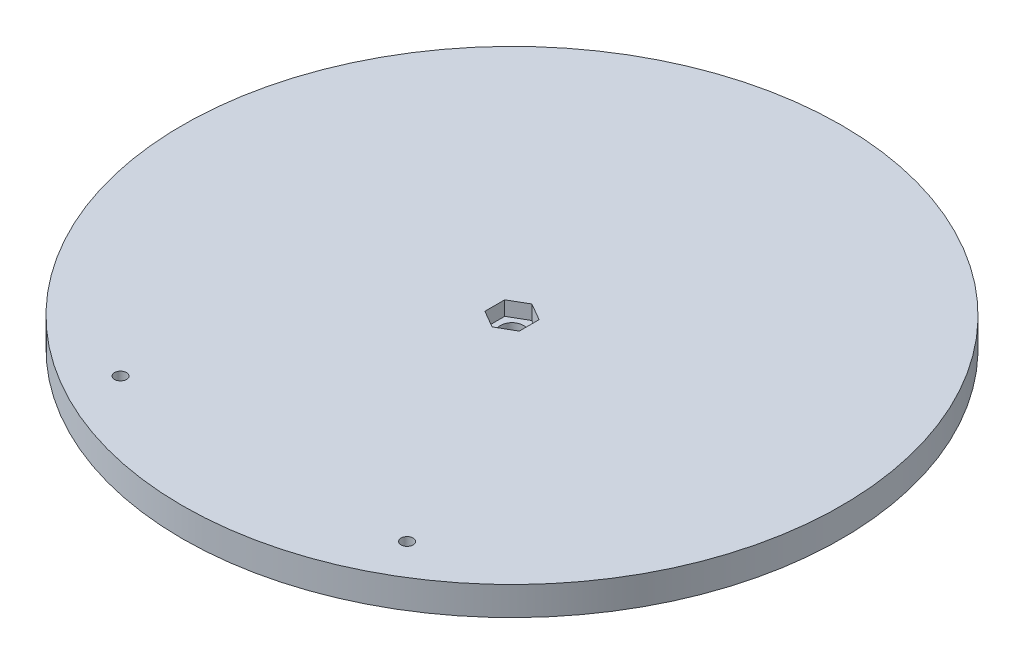
ISO-10303-21;
HEADER;
FILE_DESCRIPTION(('STEP AP214'),'2;1');
FILE_NAME('part.step','',(''),(''),'','','');
FILE_SCHEMA(('AUTOMOTIVE_DESIGN { 1 0 10303 214 1 1 1 1 }'));
ENDSEC;
DATA;
#1=APPLICATION_CONTEXT('core data for automotive mechanical design processes');
#2=APPLICATION_PROTOCOL_DEFINITION('international standard','automotive_design',2000,#1);
#3=PRODUCT_CONTEXT('',#1,'mechanical');
#4=PRODUCT('Part','Part','',(#3));
#5=PRODUCT_RELATED_PRODUCT_CATEGORY('part','',(#4));
#6=PRODUCT_DEFINITION_FORMATION('','',#4);
#7=PRODUCT_DEFINITION_CONTEXT('part definition',#1,'design');
#8=PRODUCT_DEFINITION('design','',#6,#7);
#9=PRODUCT_DEFINITION_SHAPE('','',#8);
#10=(LENGTH_UNIT() NAMED_UNIT(*) SI_UNIT(.MILLI.,.METRE.));
#11=(NAMED_UNIT(*) PLANE_ANGLE_UNIT() SI_UNIT($,.RADIAN.));
#12=(NAMED_UNIT(*) SI_UNIT($,.STERADIAN.) SOLID_ANGLE_UNIT());
#13=UNCERTAINTY_MEASURE_WITH_UNIT(LENGTH_MEASURE(1.E-05),#10,'distance_accuracy_value','');
#14=(GEOMETRIC_REPRESENTATION_CONTEXT(3) GLOBAL_UNCERTAINTY_ASSIGNED_CONTEXT((#13)) GLOBAL_UNIT_ASSIGNED_CONTEXT((#10,
#11,#12)) REPRESENTATION_CONTEXT('',''));
#15=CARTESIAN_POINT('',(0.,0.,0.));
#16=DIRECTION('',(0.,0.,1.));
#17=DIRECTION('',(1.,0.,0.));
#18=AXIS2_PLACEMENT_3D('',#15,#16,#17);
#19=CARTESIAN_POINT('',(0.,10.,0.));
#20=DIRECTION('',(0.,1.,0.));
#21=DIRECTION('',(0.,0.,1.));
#22=AXIS2_PLACEMENT_3D('',#19,#20,#21);
#23=PLANE('',#22);
#24=CARTESIAN_POINT('',(0.,10.,0.));
#25=DIRECTION('',(0.,1.,0.));
#26=DIRECTION('',(0.,0.,1.));
#27=AXIS2_PLACEMENT_3D('',#24,#25,#26);
#28=CIRCLE('',#27,115.);
#29=CARTESIAN_POINT('',(0.,10.,115.));
#30=VERTEX_POINT('',#29);
#31=EDGE_CURVE('E173',#30,#30,#28,.T.);
#32=ORIENTED_EDGE('',*,*,#31,.T.);
#33=EDGE_LOOP('',(#32));
#34=FACE_BOUND('',#33,.T.);
#35=DIRECTION('',(0.866025403784438,0.,-0.5));
#36=VECTOR('',#35,1.);
#37=CARTESIAN_POINT('',(3.,10.,5.19615242270663));
#38=LINE('',#37,#36);
#39=CARTESIAN_POINT('',(0.,10.,6.92820323027551));
#40=VERTEX_POINT('',#39);
#41=CARTESIAN_POINT('',(6.00000000000001,10.,3.46410161513775));
#42=VERTEX_POINT('',#41);
#43=EDGE_CURVE('E158',#40,#42,#38,.T.);
#44=ORIENTED_EDGE('',*,*,#43,.F.);
#45=DIRECTION('',(0.866025403784439,0.,0.5));
#46=VECTOR('',#45,1.);
#47=CARTESIAN_POINT('',(-3.,10.,5.19615242270663));
#48=LINE('',#47,#46);
#49=CARTESIAN_POINT('',(-6.,10.,3.46410161513776));
#50=VERTEX_POINT('',#49);
#51=EDGE_CURVE('E161',#50,#40,#48,.T.);
#52=ORIENTED_EDGE('',*,*,#51,.F.);
#53=DIRECTION('',(0.,0.,1.));
#54=VECTOR('',#53,1.);
#55=CARTESIAN_POINT('',(-6.,10.,0.));
#56=LINE('',#55,#54);
#57=CARTESIAN_POINT('',(-6.,10.,-3.46410161513775));
#58=VERTEX_POINT('',#57);
#59=EDGE_CURVE('E164',#58,#50,#56,.T.);
#60=ORIENTED_EDGE('',*,*,#59,.F.);
#61=DIRECTION('',(-0.866025403784439,0.,0.5));
#62=VECTOR('',#61,1.);
#63=CARTESIAN_POINT('',(-3.,10.,-5.19615242270663));
#64=LINE('',#63,#62);
#65=CARTESIAN_POINT('',(0.,10.,-6.92820323027551));
#66=VERTEX_POINT('',#65);
#67=EDGE_CURVE('E167',#66,#58,#64,.T.);
#68=ORIENTED_EDGE('',*,*,#67,.F.);
#69=DIRECTION('',(-0.866025403784439,0.,-0.5));
#70=VECTOR('',#69,1.);
#71=CARTESIAN_POINT('',(3.,10.,-5.19615242270663));
#72=LINE('',#71,#70);
#73=CARTESIAN_POINT('',(6.,10.,-3.46410161513775));
#74=VERTEX_POINT('',#73);
#75=EDGE_CURVE('E170',#74,#66,#72,.T.);
#76=ORIENTED_EDGE('',*,*,#75,.F.);
#77=DIRECTION('',(0.,0.,-1.));
#78=VECTOR('',#77,1.);
#79=CARTESIAN_POINT('',(6.,10.,0.));
#80=LINE('',#79,#78);
#81=EDGE_CURVE('E133',#42,#74,#80,.T.);
#82=ORIENTED_EDGE('',*,*,#81,.F.);
#83=EDGE_LOOP('',(#44,#52,#60,#68,#76,#82));
#84=FACE_BOUND('',#83,.T.);
#85=CARTESIAN_POINT('',(-50.,10.,86.6025403784439));
#86=DIRECTION('',(0.,1.,0.));
#87=DIRECTION('',(0.,0.,1.));
#88=AXIS2_PLACEMENT_3D('',#85,#86,#87);
#89=CIRCLE('',#88,2.1);
#90=CARTESIAN_POINT('',(-50.,10.,88.7025403784439));
#91=VERTEX_POINT('',#90);
#92=EDGE_CURVE('E324',#91,#91,#89,.T.);
#93=ORIENTED_EDGE('',*,*,#92,.F.);
#94=EDGE_LOOP('',(#93));
#95=FACE_BOUND('',#94,.T.);
#96=CARTESIAN_POINT('',(50.,10.,86.6025403784439));
#97=DIRECTION('',(0.,-1.,0.));
#98=DIRECTION('',(0.,0.,-1.));
#99=AXIS2_PLACEMENT_3D('',#96,#97,#98);
#100=CIRCLE('',#99,2.1);
#101=CARTESIAN_POINT('',(50.,10.,84.5025403784439));
#102=VERTEX_POINT('',#101);
#103=EDGE_CURVE('E319',#102,#102,#100,.T.);
#104=ORIENTED_EDGE('',*,*,#103,.T.);
#105=EDGE_LOOP('',(#104));
#106=FACE_BOUND('',#105,.T.);
#107=ADVANCED_FACE('F75',(#34,#84,#95,#106),#23,.T.);
#108=CARTESIAN_POINT('',(0.,0.,0.));
#109=DIRECTION('',(0.,1.,0.));
#110=DIRECTION('',(0.,0.,1.));
#111=AXIS2_PLACEMENT_3D('',#108,#109,#110);
#112=PLANE('',#111);
#113=CARTESIAN_POINT('',(-50.,0.,86.6025403784439));
#114=DIRECTION('',(0.,1.,0.));
#115=DIRECTION('',(0.,0.,1.));
#116=AXIS2_PLACEMENT_3D('',#113,#114,#115);
#117=CIRCLE('',#116,2.1);
#118=CARTESIAN_POINT('',(-50.,0.,88.7025403784439));
#119=VERTEX_POINT('',#118);
#120=EDGE_CURVE('E329',#119,#119,#117,.F.);
#121=ORIENTED_EDGE('',*,*,#120,.F.);
#122=EDGE_LOOP('',(#121));
#123=FACE_BOUND('',#122,.T.);
#124=CARTESIAN_POINT('',(0.,0.,0.));
#125=DIRECTION('',(0.,1.,0.));
#126=DIRECTION('',(0.,0.,1.));
#127=AXIS2_PLACEMENT_3D('',#124,#125,#126);
#128=CIRCLE('',#127,4.);
#129=CARTESIAN_POINT('',(0.,0.,4.));
#130=VERTEX_POINT('',#129);
#131=EDGE_CURVE('E326',#130,#130,#128,.T.);
#132=ORIENTED_EDGE('',*,*,#131,.T.);
#133=EDGE_LOOP('',(#132));
#134=FACE_BOUND('',#133,.T.);
#135=CARTESIAN_POINT('',(0.,0.,0.));
#136=DIRECTION('',(0.,1.,0.));
#137=DIRECTION('',(0.,0.,1.));
#138=AXIS2_PLACEMENT_3D('',#135,#136,#137);
#139=CIRCLE('',#138,115.);
#140=CARTESIAN_POINT('',(0.,0.,115.));
#141=VERTEX_POINT('',#140);
#142=EDGE_CURVE('E157',#141,#141,#139,.T.);
#143=ORIENTED_EDGE('',*,*,#142,.F.);
#144=EDGE_LOOP('',(#143));
#145=FACE_BOUND('',#144,.T.);
#146=CARTESIAN_POINT('',(50.,0.,86.6025403784439));
#147=DIRECTION('',(0.,1.,0.));
#148=DIRECTION('',(0.,0.,1.));
#149=AXIS2_PLACEMENT_3D('',#146,#147,#148);
#150=CIRCLE('',#149,2.1);
#151=CARTESIAN_POINT('',(50.,0.,88.7025403784439));
#152=VERTEX_POINT('',#151);
#153=EDGE_CURVE('E322',#152,#152,#150,.T.);
#154=ORIENTED_EDGE('',*,*,#153,.T.);
#155=EDGE_LOOP('',(#154));
#156=FACE_BOUND('',#155,.T.);
#157=ADVANCED_FACE('F194',(#123,#134,#145,#156),#112,.F.);
#158=CARTESIAN_POINT('',(3.,10.,5.19615242270663));
#159=DIRECTION('',(-0.5,0.,-0.866025403784438));
#160=DIRECTION('',(-0.866025403784438,0.,0.5));
#161=AXIS2_PLACEMENT_3D('',#158,#159,#160);
#162=PLANE('',#161);
#163=DIRECTION('',(0.866025403784438,0.,-0.5));
#164=VECTOR('',#163,1.);
#165=CARTESIAN_POINT('',(3.,5.,5.19615242270663));
#166=LINE('',#165,#164);
#167=CARTESIAN_POINT('',(0.,5.,6.92820323027551));
#168=VERTEX_POINT('',#167);
#169=CARTESIAN_POINT('',(6.00000000000001,5.,3.46410161513775));
#170=VERTEX_POINT('',#169);
#171=EDGE_CURVE('E90',#168,#170,#166,.T.);
#172=ORIENTED_EDGE('',*,*,#171,.F.);
#173=DIRECTION('',(0.,-1.,0.));
#174=VECTOR('',#173,1.);
#175=CARTESIAN_POINT('',(0.,10.,6.92820323027551));
#176=LINE('',#175,#174);
#177=EDGE_CURVE('E12',#40,#168,#176,.T.);
#178=ORIENTED_EDGE('',*,*,#177,.F.);
#179=ORIENTED_EDGE('',*,*,#43,.T.);
#180=DIRECTION('',(0.,-1.,0.));
#181=VECTOR('',#180,1.);
#182=CARTESIAN_POINT('',(6.00000000000001,10.,3.46410161513775));
#183=LINE('',#182,#181);
#184=EDGE_CURVE('E138',#42,#170,#183,.T.);
#185=ORIENTED_EDGE('',*,*,#184,.T.);
#186=EDGE_LOOP('',(#172,#178,#179,#185));
#187=FACE_BOUND('',#186,.T.);
#188=ADVANCED_FACE('F77',(#187),#162,.T.);
#189=CARTESIAN_POINT('',(-3.,10.,5.19615242270663));
#190=DIRECTION('',(0.5,0.,-0.866025403784439));
#191=DIRECTION('',(-0.866025403784439,0.,-0.5));
#192=AXIS2_PLACEMENT_3D('',#189,#190,#191);
#193=PLANE('',#192);
#194=DIRECTION('',(0.866025403784439,0.,0.5));
#195=VECTOR('',#194,1.);
#196=CARTESIAN_POINT('',(-3.,5.,5.19615242270663));
#197=LINE('',#196,#195);
#198=CARTESIAN_POINT('',(-6.,5.,3.46410161513776));
#199=VERTEX_POINT('',#198);
#200=EDGE_CURVE('E96',#199,#168,#197,.T.);
#201=ORIENTED_EDGE('',*,*,#200,.F.);
#202=DIRECTION('',(0.,-1.,0.));
#203=VECTOR('',#202,1.);
#204=CARTESIAN_POINT('',(-6.,10.,3.46410161513776));
#205=LINE('',#204,#203);
#206=EDGE_CURVE('E83',#50,#199,#205,.T.);
#207=ORIENTED_EDGE('',*,*,#206,.F.);
#208=ORIENTED_EDGE('',*,*,#51,.T.);
#209=ORIENTED_EDGE('',*,*,#177,.T.);
#210=EDGE_LOOP('',(#201,#207,#208,#209));
#211=FACE_BOUND('',#210,.T.);
#212=ADVANCED_FACE('F192',(#211),#193,.T.);
#213=CARTESIAN_POINT('',(-6.,10.,0.));
#214=DIRECTION('',(1.,0.,0.));
#215=DIRECTION('',(0.,0.,-1.));
#216=AXIS2_PLACEMENT_3D('',#213,#214,#215);
#217=PLANE('',#216);
#218=DIRECTION('',(0.,0.,1.));
#219=VECTOR('',#218,1.);
#220=CARTESIAN_POINT('',(-6.,5.,0.));
#221=LINE('',#220,#219);
#222=CARTESIAN_POINT('',(-6.,5.,-3.46410161513775));
#223=VERTEX_POINT('',#222);
#224=EDGE_CURVE('E154',#223,#199,#221,.T.);
#225=ORIENTED_EDGE('',*,*,#224,.F.);
#226=DIRECTION('',(0.,-1.,0.));
#227=VECTOR('',#226,1.);
#228=CARTESIAN_POINT('',(-6.,10.,-3.46410161513775));
#229=LINE('',#228,#227);
#230=EDGE_CURVE('E180',#58,#223,#229,.T.);
#231=ORIENTED_EDGE('',*,*,#230,.F.);
#232=ORIENTED_EDGE('',*,*,#59,.T.);
#233=ORIENTED_EDGE('',*,*,#206,.T.);
#234=EDGE_LOOP('',(#225,#231,#232,#233));
#235=FACE_BOUND('',#234,.T.);
#236=ADVANCED_FACE('F183',(#235),#217,.T.);
#237=CARTESIAN_POINT('',(-3.,10.,-5.19615242270663));
#238=DIRECTION('',(0.5,0.,0.866025403784439));
#239=DIRECTION('',(0.866025403784439,0.,-0.5));
#240=AXIS2_PLACEMENT_3D('',#237,#238,#239);
#241=PLANE('',#240);
#242=DIRECTION('',(-0.866025403784439,0.,0.5));
#243=VECTOR('',#242,1.);
#244=CARTESIAN_POINT('',(-3.,5.,-5.19615242270663));
#245=LINE('',#244,#243);
#246=CARTESIAN_POINT('',(0.,5.,-6.92820323027551));
#247=VERTEX_POINT('',#246);
#248=EDGE_CURVE('E146',#247,#223,#245,.T.);
#249=ORIENTED_EDGE('',*,*,#248,.F.);
#250=DIRECTION('',(0.,-1.,0.));
#251=VECTOR('',#250,1.);
#252=CARTESIAN_POINT('',(0.,10.,-6.92820323027551));
#253=LINE('',#252,#251);
#254=EDGE_CURVE('E137',#66,#247,#253,.T.);
#255=ORIENTED_EDGE('',*,*,#254,.F.);
#256=ORIENTED_EDGE('',*,*,#67,.T.);
#257=ORIENTED_EDGE('',*,*,#230,.T.);
#258=EDGE_LOOP('',(#249,#255,#256,#257));
#259=FACE_BOUND('',#258,.T.);
#260=ADVANCED_FACE('F187',(#259),#241,.T.);
#261=CARTESIAN_POINT('',(3.,10.,-5.19615242270663));
#262=DIRECTION('',(-0.5,0.,0.866025403784439));
#263=DIRECTION('',(0.866025403784439,0.,0.5));
#264=AXIS2_PLACEMENT_3D('',#261,#262,#263);
#265=PLANE('',#264);
#266=DIRECTION('',(-0.866025403784439,0.,-0.5));
#267=VECTOR('',#266,1.);
#268=CARTESIAN_POINT('',(3.,5.,-5.19615242270663));
#269=LINE('',#268,#267);
#270=CARTESIAN_POINT('',(6.,5.,-3.46410161513775));
#271=VERTEX_POINT('',#270);
#272=EDGE_CURVE('E142',#271,#247,#269,.T.);
#273=ORIENTED_EDGE('',*,*,#272,.F.);
#274=DIRECTION('',(0.,-1.,0.));
#275=VECTOR('',#274,1.);
#276=CARTESIAN_POINT('',(6.,10.,-3.46410161513775));
#277=LINE('',#276,#275);
#278=EDGE_CURVE('E127',#74,#271,#277,.T.);
#279=ORIENTED_EDGE('',*,*,#278,.F.);
#280=ORIENTED_EDGE('',*,*,#75,.T.);
#281=ORIENTED_EDGE('',*,*,#254,.T.);
#282=EDGE_LOOP('',(#273,#279,#280,#281));
#283=FACE_BOUND('',#282,.T.);
#284=ADVANCED_FACE('F143',(#283),#265,.T.);
#285=CARTESIAN_POINT('',(6.,10.,0.));
#286=DIRECTION('',(-1.,0.,0.));
#287=DIRECTION('',(0.,0.,1.));
#288=AXIS2_PLACEMENT_3D('',#285,#286,#287);
#289=PLANE('',#288);
#290=DIRECTION('',(0.,0.,-1.));
#291=VECTOR('',#290,1.);
#292=CARTESIAN_POINT('',(6.,5.,0.));
#293=LINE('',#292,#291);
#294=EDGE_CURVE('E131',#170,#271,#293,.T.);
#295=ORIENTED_EDGE('',*,*,#294,.F.);
#296=ORIENTED_EDGE('',*,*,#184,.F.);
#297=ORIENTED_EDGE('',*,*,#81,.T.);
#298=ORIENTED_EDGE('',*,*,#278,.T.);
#299=EDGE_LOOP('',(#295,#296,#297,#298));
#300=FACE_BOUND('',#299,.T.);
#301=ADVANCED_FACE('F129',(#300),#289,.T.);
#302=CARTESIAN_POINT('',(0.,10.,0.));
#303=DIRECTION('',(0.,-1.,0.));
#304=DIRECTION('',(0.,0.,-1.));
#305=AXIS2_PLACEMENT_3D('',#302,#303,#304);
#306=CYLINDRICAL_SURFACE('',#305,115.);
#307=ORIENTED_EDGE('',*,*,#31,.F.);
#308=EDGE_LOOP('',(#307));
#309=FACE_BOUND('',#308,.T.);
#310=ORIENTED_EDGE('',*,*,#142,.T.);
#311=EDGE_LOOP('',(#310));
#312=FACE_BOUND('',#311,.T.);
#313=ADVANCED_FACE('F209',(#309,#312),#306,.T.);
#314=CARTESIAN_POINT('',(0.,5.,0.));
#315=DIRECTION('',(0.,1.,0.));
#316=DIRECTION('',(0.,0.,1.));
#317=AXIS2_PLACEMENT_3D('',#314,#315,#316);
#318=PLANE('',#317);
#319=CARTESIAN_POINT('',(0.,5.,0.));
#320=DIRECTION('',(0.,1.,0.));
#321=DIRECTION('',(0.,0.,1.));
#322=AXIS2_PLACEMENT_3D('',#319,#320,#321);
#323=CIRCLE('',#322,4.);
#324=CARTESIAN_POINT('',(0.,5.,4.));
#325=VERTEX_POINT('',#324);
#326=EDGE_CURVE('E336',#325,#325,#323,.T.);
#327=ORIENTED_EDGE('',*,*,#326,.F.);
#328=EDGE_LOOP('',(#327));
#329=FACE_BOUND('',#328,.T.);
#330=ORIENTED_EDGE('',*,*,#200,.T.);
#331=ORIENTED_EDGE('',*,*,#171,.T.);
#332=ORIENTED_EDGE('',*,*,#294,.T.);
#333=ORIENTED_EDGE('',*,*,#272,.T.);
#334=ORIENTED_EDGE('',*,*,#248,.T.);
#335=ORIENTED_EDGE('',*,*,#224,.T.);
#336=EDGE_LOOP('',(#330,#331,#332,#333,#334,#335));
#337=FACE_BOUND('',#336,.T.);
#338=ADVANCED_FACE('F148',(#329,#337),#318,.T.);
#339=CARTESIAN_POINT('',(0.,10.001,0.));
#340=DIRECTION('',(0.,-1.,0.));
#341=DIRECTION('',(0.,0.,-1.));
#342=AXIS2_PLACEMENT_3D('',#339,#340,#341);
#343=CYLINDRICAL_SURFACE('',#342,4.);
#344=ORIENTED_EDGE('',*,*,#326,.T.);
#345=EDGE_LOOP('',(#344));
#346=FACE_BOUND('',#345,.T.);
#347=ORIENTED_EDGE('',*,*,#131,.F.);
#348=EDGE_LOOP('',(#347));
#349=FACE_BOUND('',#348,.T.);
#350=ADVANCED_FACE('F246',(#346,#349),#343,.F.);
#351=CARTESIAN_POINT('',(-50.,-0.000999999999999265,86.6025403784439));
#352=DIRECTION('',(0.,1.,0.));
#353=DIRECTION('',(0.,0.,1.));
#354=AXIS2_PLACEMENT_3D('',#351,#352,#353);
#355=CYLINDRICAL_SURFACE('',#354,2.1);
#356=ORIENTED_EDGE('',*,*,#92,.T.);
#357=EDGE_LOOP('',(#356));
#358=FACE_BOUND('',#357,.T.);
#359=ORIENTED_EDGE('',*,*,#120,.T.);
#360=EDGE_LOOP('',(#359));
#361=FACE_BOUND('',#360,.T.);
#362=ADVANCED_FACE('F253',(#358,#361),#355,.F.);
#363=CARTESIAN_POINT('',(50.,-0.000999999999999265,86.6025403784439));
#364=DIRECTION('',(0.,1.,0.));
#365=DIRECTION('',(0.,0.,1.));
#366=AXIS2_PLACEMENT_3D('',#363,#364,#365);
#367=CYLINDRICAL_SURFACE('',#366,2.1);
#368=ORIENTED_EDGE('',*,*,#103,.F.);
#369=EDGE_LOOP('',(#368));
#370=FACE_BOUND('',#369,.T.);
#371=ORIENTED_EDGE('',*,*,#153,.F.);
#372=EDGE_LOOP('',(#371));
#373=FACE_BOUND('',#372,.T.);
#374=ADVANCED_FACE('F260',(#370,#373),#367,.F.);
#375=CLOSED_SHELL('',(#107,#157,#188,#212,#236,#260,#284,#301,#313,#338,#350,#362,#374));
#376=MANIFOLD_SOLID_BREP('B2',#375);
#377=ADVANCED_BREP_SHAPE_REPRESENTATION('',(#18,#376),#14);
#378=SHAPE_DEFINITION_REPRESENTATION(#9,#377);
ENDSEC;
END-ISO-10303-21;
